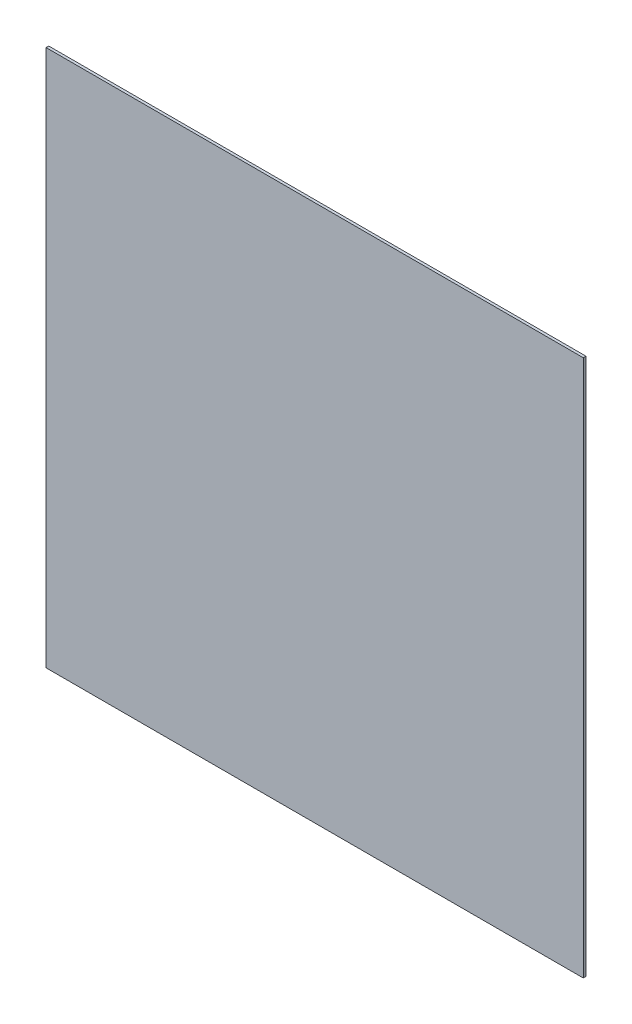
ISO-10303-21;
HEADER;
FILE_DESCRIPTION(('STEP AP214'),'2;1');
FILE_NAME('part.step','',(''),(''),'','','');
FILE_SCHEMA(('AUTOMOTIVE_DESIGN { 1 0 10303 214 1 1 1 1 }'));
ENDSEC;
DATA;
#1=APPLICATION_CONTEXT('core data for automotive mechanical design processes');
#2=APPLICATION_PROTOCOL_DEFINITION('international standard','automotive_design',2000,#1);
#3=PRODUCT_CONTEXT('',#1,'mechanical');
#4=PRODUCT('Part','Part','',(#3));
#5=PRODUCT_RELATED_PRODUCT_CATEGORY('part','',(#4));
#6=PRODUCT_DEFINITION_FORMATION('','',#4);
#7=PRODUCT_DEFINITION_CONTEXT('part definition',#1,'design');
#8=PRODUCT_DEFINITION('design','',#6,#7);
#9=PRODUCT_DEFINITION_SHAPE('','',#8);
#10=(LENGTH_UNIT() NAMED_UNIT(*) SI_UNIT(.MILLI.,.METRE.));
#11=(NAMED_UNIT(*) PLANE_ANGLE_UNIT() SI_UNIT($,.RADIAN.));
#12=(NAMED_UNIT(*) SI_UNIT($,.STERADIAN.) SOLID_ANGLE_UNIT());
#13=UNCERTAINTY_MEASURE_WITH_UNIT(LENGTH_MEASURE(1.E-05),#10,'distance_accuracy_value','');
#14=(GEOMETRIC_REPRESENTATION_CONTEXT(3) GLOBAL_UNCERTAINTY_ASSIGNED_CONTEXT((#13)) GLOBAL_UNIT_ASSIGNED_CONTEXT((#10,
#11,#12)) REPRESENTATION_CONTEXT('',''));
#15=CARTESIAN_POINT('',(0.,0.,0.));
#16=DIRECTION('',(0.,0.,1.));
#17=DIRECTION('',(1.,0.,0.));
#18=AXIS2_PLACEMENT_3D('',#15,#16,#17);
#19=CARTESIAN_POINT('',(0.,41.6,-321.6));
#20=DIRECTION('',(-1.,0.,0.));
#21=DIRECTION('',(0.,0.,1.));
#22=AXIS2_PLACEMENT_3D('',#19,#20,#21);
#23=PLANE('',#22);
#24=DIRECTION('',(0.,-1.,0.));
#25=VECTOR('',#24,1.);
#26=CARTESIAN_POINT('',(0.,41.6,-320.));
#27=LINE('',#26,#25);
#28=CARTESIAN_POINT('',(0.,361.6,-320.));
#29=VERTEX_POINT('',#28);
#30=CARTESIAN_POINT('',(0.,41.6,-320.));
#31=VERTEX_POINT('',#30);
#32=EDGE_CURVE('E103',#29,#31,#27,.T.);
#33=ORIENTED_EDGE('',*,*,#32,.F.);
#34=DIRECTION('',(0.,0.,1.));
#35=VECTOR('',#34,1.);
#36=CARTESIAN_POINT('',(0.,361.6,-321.6));
#37=LINE('',#36,#35);
#38=CARTESIAN_POINT('',(0.,361.6,-321.6));
#39=VERTEX_POINT('',#38);
#40=EDGE_CURVE('E11',#39,#29,#37,.T.);
#41=ORIENTED_EDGE('',*,*,#40,.F.);
#42=DIRECTION('',(0.,-1.,0.));
#43=VECTOR('',#42,1.);
#44=CARTESIAN_POINT('',(0.,41.6,-321.6));
#45=LINE('',#44,#43);
#46=CARTESIAN_POINT('',(0.,41.6,-321.6));
#47=VERTEX_POINT('',#46);
#48=EDGE_CURVE('E97',#39,#47,#45,.T.);
#49=ORIENTED_EDGE('',*,*,#48,.T.);
#50=DIRECTION('',(0.,0.,1.));
#51=VECTOR('',#50,1.);
#52=CARTESIAN_POINT('',(0.,41.6,-321.6));
#53=LINE('',#52,#51);
#54=EDGE_CURVE('E42',#47,#31,#53,.T.);
#55=ORIENTED_EDGE('',*,*,#54,.T.);
#56=EDGE_LOOP('',(#33,#41,#49,#55));
#57=FACE_BOUND('',#56,.T.);
#58=ADVANCED_FACE('F39',(#57),#23,.T.);
#59=CARTESIAN_POINT('',(0.,361.6,-321.6));
#60=DIRECTION('',(0.,1.,0.));
#61=DIRECTION('',(0.,0.,1.));
#62=AXIS2_PLACEMENT_3D('',#59,#60,#61);
#63=PLANE('',#62);
#64=DIRECTION('',(-1.,0.,0.));
#65=VECTOR('',#64,1.);
#66=CARTESIAN_POINT('',(0.,361.6,-320.));
#67=LINE('',#66,#65);
#68=CARTESIAN_POINT('',(320.,361.6,-320.));
#69=VERTEX_POINT('',#68);
#70=EDGE_CURVE('E99',#69,#29,#67,.T.);
#71=ORIENTED_EDGE('',*,*,#70,.F.);
#72=DIRECTION('',(0.,0.,1.));
#73=VECTOR('',#72,1.);
#74=CARTESIAN_POINT('',(320.,361.6,-321.6));
#75=LINE('',#74,#73);
#76=CARTESIAN_POINT('',(320.,361.6,-321.6));
#77=VERTEX_POINT('',#76);
#78=EDGE_CURVE('E48',#77,#69,#75,.T.);
#79=ORIENTED_EDGE('',*,*,#78,.F.);
#80=DIRECTION('',(-1.,0.,0.));
#81=VECTOR('',#80,1.);
#82=CARTESIAN_POINT('',(0.,361.6,-321.6));
#83=LINE('',#82,#81);
#84=EDGE_CURVE('E94',#77,#39,#83,.T.);
#85=ORIENTED_EDGE('',*,*,#84,.T.);
#86=ORIENTED_EDGE('',*,*,#40,.T.);
#87=EDGE_LOOP('',(#71,#79,#85,#86));
#88=FACE_BOUND('',#87,.T.);
#89=ADVANCED_FACE('F113',(#88),#63,.T.);
#90=CARTESIAN_POINT('',(320.,41.6,-321.6));
#91=DIRECTION('',(1.,0.,0.));
#92=DIRECTION('',(0.,0.,-1.));
#93=AXIS2_PLACEMENT_3D('',#90,#91,#92);
#94=PLANE('',#93);
#95=DIRECTION('',(0.,1.,0.));
#96=VECTOR('',#95,1.);
#97=CARTESIAN_POINT('',(320.,41.6,-320.));
#98=LINE('',#97,#96);
#99=CARTESIAN_POINT('',(320.,41.6,-320.));
#100=VERTEX_POINT('',#99);
#101=EDGE_CURVE('E89',#100,#69,#98,.T.);
#102=ORIENTED_EDGE('',*,*,#101,.F.);
#103=DIRECTION('',(0.,0.,1.));
#104=VECTOR('',#103,1.);
#105=CARTESIAN_POINT('',(320.,41.6,-321.6));
#106=LINE('',#105,#104);
#107=CARTESIAN_POINT('',(320.,41.6,-321.6));
#108=VERTEX_POINT('',#107);
#109=EDGE_CURVE('E84',#108,#100,#106,.T.);
#110=ORIENTED_EDGE('',*,*,#109,.F.);
#111=DIRECTION('',(0.,1.,0.));
#112=VECTOR('',#111,1.);
#113=CARTESIAN_POINT('',(320.,41.6,-321.6));
#114=LINE('',#113,#112);
#115=EDGE_CURVE('E87',#108,#77,#114,.T.);
#116=ORIENTED_EDGE('',*,*,#115,.T.);
#117=ORIENTED_EDGE('',*,*,#78,.T.);
#118=EDGE_LOOP('',(#102,#110,#116,#117));
#119=FACE_BOUND('',#118,.T.);
#120=ADVANCED_FACE('F86',(#119),#94,.T.);
#121=CARTESIAN_POINT('',(0.,41.6,-321.6));
#122=DIRECTION('',(0.,-1.,0.));
#123=DIRECTION('',(0.,0.,-1.));
#124=AXIS2_PLACEMENT_3D('',#121,#122,#123);
#125=PLANE('',#124);
#126=DIRECTION('',(1.,0.,0.));
#127=VECTOR('',#126,1.);
#128=CARTESIAN_POINT('',(0.,41.6,-320.));
#129=LINE('',#128,#127);
#130=EDGE_CURVE('E106',#31,#100,#129,.T.);
#131=ORIENTED_EDGE('',*,*,#130,.F.);
#132=ORIENTED_EDGE('',*,*,#54,.F.);
#133=DIRECTION('',(1.,0.,0.));
#134=VECTOR('',#133,1.);
#135=CARTESIAN_POINT('',(0.,41.6,-321.6));
#136=LINE('',#135,#134);
#137=EDGE_CURVE('E93',#47,#108,#136,.T.);
#138=ORIENTED_EDGE('',*,*,#137,.T.);
#139=ORIENTED_EDGE('',*,*,#109,.T.);
#140=EDGE_LOOP('',(#131,#132,#138,#139));
#141=FACE_BOUND('',#140,.T.);
#142=ADVANCED_FACE('F96',(#141),#125,.T.);
#143=CARTESIAN_POINT('',(0.,0.,-321.6));
#144=DIRECTION('',(0.,0.,-1.));
#145=DIRECTION('',(-1.,0.,0.));
#146=AXIS2_PLACEMENT_3D('',#143,#144,#145);
#147=PLANE('',#146);
#148=ORIENTED_EDGE('',*,*,#48,.F.);
#149=ORIENTED_EDGE('',*,*,#84,.F.);
#150=ORIENTED_EDGE('',*,*,#115,.F.);
#151=ORIENTED_EDGE('',*,*,#137,.F.);
#152=EDGE_LOOP('',(#148,#149,#150,#151));
#153=FACE_BOUND('',#152,.T.);
#154=ADVANCED_FACE('F92',(#153),#147,.T.);
#155=CARTESIAN_POINT('',(0.,0.,-320.));
#156=DIRECTION('',(0.,0.,-1.));
#157=DIRECTION('',(-1.,0.,0.));
#158=AXIS2_PLACEMENT_3D('',#155,#156,#157);
#159=PLANE('',#158);
#160=ORIENTED_EDGE('',*,*,#32,.T.);
#161=ORIENTED_EDGE('',*,*,#130,.T.);
#162=ORIENTED_EDGE('',*,*,#101,.T.);
#163=ORIENTED_EDGE('',*,*,#70,.T.);
#164=EDGE_LOOP('',(#160,#161,#162,#163));
#165=FACE_BOUND('',#164,.T.);
#166=ADVANCED_FACE('F112',(#165),#159,.F.);
#167=CLOSED_SHELL('',(#58,#89,#120,#142,#154,#166));
#168=MANIFOLD_SOLID_BREP('B2',#167);
#169=ADVANCED_BREP_SHAPE_REPRESENTATION('',(#18,#168),#14);
#170=SHAPE_DEFINITION_REPRESENTATION(#9,#169);
ENDSEC;
END-ISO-10303-21;
